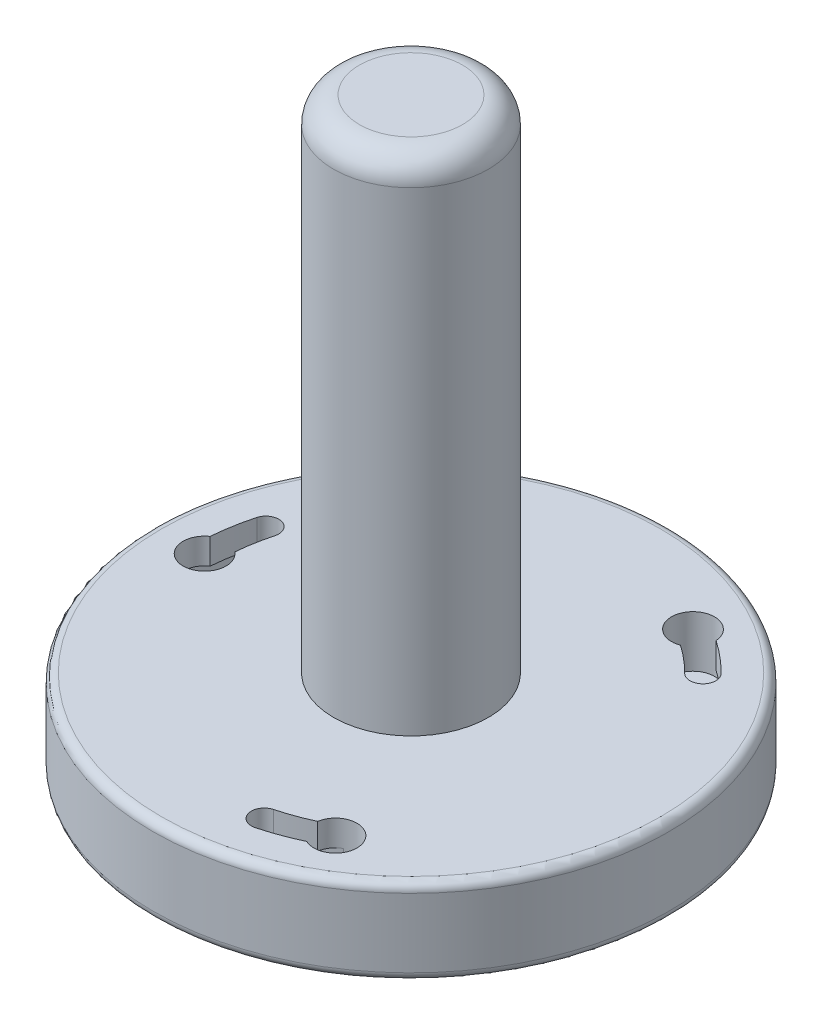
ISO-10303-21;
HEADER;
FILE_DESCRIPTION(('STEP AP214'),'2;1');
FILE_NAME('part.step','',(''),(''),'','','');
FILE_SCHEMA(('AUTOMOTIVE_DESIGN { 1 0 10303 214 1 1 1 1 }'));
ENDSEC;
DATA;
#1=APPLICATION_CONTEXT('core data for automotive mechanical design processes');
#2=APPLICATION_PROTOCOL_DEFINITION('international standard','automotive_design',2000,#1);
#3=PRODUCT_CONTEXT('',#1,'mechanical');
#4=PRODUCT('Part','Part','',(#3));
#5=PRODUCT_RELATED_PRODUCT_CATEGORY('part','',(#4));
#6=PRODUCT_DEFINITION_FORMATION('','',#4);
#7=PRODUCT_DEFINITION_CONTEXT('part definition',#1,'design');
#8=PRODUCT_DEFINITION('design','',#6,#7);
#9=PRODUCT_DEFINITION_SHAPE('','',#8);
#10=(LENGTH_UNIT() NAMED_UNIT(*) SI_UNIT(.MILLI.,.METRE.));
#11=(NAMED_UNIT(*) PLANE_ANGLE_UNIT() SI_UNIT($,.RADIAN.));
#12=(NAMED_UNIT(*) SI_UNIT($,.STERADIAN.) SOLID_ANGLE_UNIT());
#13=UNCERTAINTY_MEASURE_WITH_UNIT(LENGTH_MEASURE(1.E-05),#10,'distance_accuracy_value','');
#14=(GEOMETRIC_REPRESENTATION_CONTEXT(3) GLOBAL_UNCERTAINTY_ASSIGNED_CONTEXT((#13)) GLOBAL_UNIT_ASSIGNED_CONTEXT((#10,
#11,#12)) REPRESENTATION_CONTEXT('',''));
#15=CARTESIAN_POINT('',(0.,0.,0.));
#16=DIRECTION('',(0.,0.,1.));
#17=DIRECTION('',(1.,0.,0.));
#18=AXIS2_PLACEMENT_3D('',#15,#16,#17);
#19=CARTESIAN_POINT('',(0.,12.7,0.));
#20=DIRECTION('',(0.,-1.,0.));
#21=DIRECTION('',(0.,0.,-1.));
#22=AXIS2_PLACEMENT_3D('',#19,#20,#21);
#23=CYLINDRICAL_SURFACE('',#22,38.1);
#24=CARTESIAN_POINT('',(0.,1.27,0.));
#25=DIRECTION('',(0.,1.,0.));
#26=DIRECTION('',(0.,0.,1.));
#27=AXIS2_PLACEMENT_3D('',#24,#25,#26);
#28=CIRCLE('',#27,38.1);
#29=CARTESIAN_POINT('',(0.,1.27,38.1));
#30=VERTEX_POINT('',#29);
#31=EDGE_CURVE('E405',#30,#30,#28,.T.);
#32=ORIENTED_EDGE('',*,*,#31,.T.);
#33=EDGE_LOOP('',(#32));
#34=FACE_BOUND('',#33,.T.);
#35=CARTESIAN_POINT('',(0.,11.43,0.));
#36=DIRECTION('',(0.,1.,0.));
#37=DIRECTION('',(0.,0.,1.));
#38=AXIS2_PLACEMENT_3D('',#35,#36,#37);
#39=CIRCLE('',#38,38.1);
#40=CARTESIAN_POINT('',(0.,11.43,38.1));
#41=VERTEX_POINT('',#40);
#42=EDGE_CURVE('E402',#41,#41,#39,.F.);
#43=ORIENTED_EDGE('',*,*,#42,.T.);
#44=EDGE_LOOP('',(#43));
#45=FACE_BOUND('',#44,.T.);
#46=ADVANCED_FACE('F34',(#34,#45),#23,.T.);
#47=CARTESIAN_POINT('',(0.,12.7,0.));
#48=DIRECTION('',(0.,1.,0.));
#49=DIRECTION('',(0.,0.,1.));
#50=AXIS2_PLACEMENT_3D('',#47,#48,#49);
#51=PLANE('',#50);
#52=CARTESIAN_POINT('',(0.,12.7,0.));
#53=DIRECTION('',(0.,-1.,0.));
#54=DIRECTION('',(0.,0.,-1.));
#55=AXIS2_PLACEMENT_3D('',#52,#53,#54);
#56=CIRCLE('',#55,32.385);
#57=CARTESIAN_POINT('',(13.8740330184725,12.7,29.2625944304728));
#58=VERTEX_POINT('',#57);
#59=CARTESIAN_POINT('',(8.28653723864922,12.7,31.3068926211542));
#60=VERTEX_POINT('',#59);
#61=EDGE_CURVE('E303',#58,#60,#56,.T.);
#62=ORIENTED_EDGE('',*,*,#61,.T.);
#63=CARTESIAN_POINT('',(7.79909387166985,12.7,29.4653107022628));
#64=DIRECTION('',(0.,-1.,0.));
#65=DIRECTION('',(0.,0.,-1.));
#66=AXIS2_PLACEMENT_3D('',#63,#64,#65);
#67=CIRCLE('',#66,1.905);
#68=CARTESIAN_POINT('',(7.31165050469049,12.7,27.6237287833714));
#69=VERTEX_POINT('',#68);
#70=EDGE_CURVE('E49',#60,#69,#67,.T.);
#71=ORIENTED_EDGE('',*,*,#70,.T.);
#72=CARTESIAN_POINT('',(0.,12.7,0.));
#73=DIRECTION('',(0.,1.,0.));
#74=DIRECTION('',(0.,0.,-1.));
#75=AXIS2_PLACEMENT_3D('',#72,#73,#74);
#76=CIRCLE('',#75,28.575);
#77=CARTESIAN_POINT('',(12.106701586345,12.7,25.8835546573339));
#78=VERTEX_POINT('',#77);
#79=EDGE_CURVE('E315',#69,#78,#76,.T.);
#80=ORIENTED_EDGE('',*,*,#79,.T.);
#81=CARTESIAN_POINT('',(15.2400000000001,12.7,26.3964543073496));
#82=DIRECTION('',(0.,-1.,0.));
#83=DIRECTION('',(0.,0.,-1.));
#84=AXIS2_PLACEMENT_3D('',#81,#82,#83);
#85=CIRCLE('',#84,3.175);
#86=EDGE_CURVE('E319',#78,#58,#85,.T.);
#87=ORIENTED_EDGE('',*,*,#86,.T.);
#88=EDGE_LOOP('',(#62,#71,#80,#87));
#89=FACE_BOUND('',#88,.T.);
#90=CARTESIAN_POINT('',(0.,12.7,0.));
#91=DIRECTION('',(0.,-1.,0.));
#92=DIRECTION('',(0.,0.,-1.));
#93=AXIS2_PLACEMENT_3D('',#90,#91,#92);
#94=CIRCLE('',#93,32.385);
#95=CARTESIAN_POINT('',(18.4051336481941,12.7,-26.6465622621777));
#96=VERTEX_POINT('',#95);
#97=CARTESIAN_POINT('',(22.9692957041464,12.7,-22.8297980686532));
#98=VERTEX_POINT('',#97);
#99=EDGE_CURVE('E336',#96,#98,#94,.T.);
#100=ORIENTED_EDGE('',*,*,#99,.T.);
#101=CARTESIAN_POINT('',(21.618160662726,12.7,-21.4868687704971));
#102=DIRECTION('',(0.,-1.,0.));
#103=DIRECTION('',(0.,0.,-1.));
#104=AXIS2_PLACEMENT_3D('',#101,#102,#103);
#105=CIRCLE('',#104,1.905);
#106=CARTESIAN_POINT('',(20.2670256213057,12.7,-20.143939472341));
#107=VERTEX_POINT('',#106);
#108=EDGE_CURVE('E57',#98,#107,#105,.T.);
#109=ORIENTED_EDGE('',*,*,#108,.T.);
#110=CARTESIAN_POINT('',(0.,12.7,0.));
#111=DIRECTION('',(0.,1.,0.));
#112=DIRECTION('',(0.,0.,-1.));
#113=AXIS2_PLACEMENT_3D('',#110,#111,#112);
#114=CIRCLE('',#113,28.575);
#115=CARTESIAN_POINT('',(16.3624650803216,12.7,-23.4264884584791));
#116=VERTEX_POINT('',#115);
#117=EDGE_CURVE('E348',#107,#116,#114,.T.);
#118=ORIENTED_EDGE('',*,*,#117,.T.);
#119=CARTESIAN_POINT('',(15.2399999999998,12.7,-26.3964543073498));
#120=DIRECTION('',(0.,-1.,0.));
#121=DIRECTION('',(0.,0.,-1.));
#122=AXIS2_PLACEMENT_3D('',#119,#120,#121);
#123=CIRCLE('',#122,3.175);
#124=EDGE_CURVE('E351',#116,#96,#123,.T.);
#125=ORIENTED_EDGE('',*,*,#124,.T.);
#126=EDGE_LOOP('',(#100,#109,#118,#125));
#127=FACE_BOUND('',#126,.T.);
#128=CARTESIAN_POINT('',(-30.48,12.7,0.));
#129=DIRECTION('',(0.,-1.,0.));
#130=DIRECTION('',(0.,0.,-1.));
#131=AXIS2_PLACEMENT_3D('',#128,#129,#130);
#132=CIRCLE('',#131,3.175);
#133=CARTESIAN_POINT('',(-28.4691666666667,12.7,-2.45706619885497));
#134=VERTEX_POINT('',#133);
#135=CARTESIAN_POINT('',(-32.2791666666667,12.7,-2.61603216829525));
#136=VERTEX_POINT('',#135);
#137=EDGE_CURVE('E366',#134,#136,#132,.T.);
#138=ORIENTED_EDGE('',*,*,#137,.T.);
#139=CARTESIAN_POINT('',(0.,12.7,0.));
#140=DIRECTION('',(0.,-1.,0.));
#141=DIRECTION('',(0.,0.,-1.));
#142=AXIS2_PLACEMENT_3D('',#139,#140,#141);
#143=CIRCLE('',#142,32.385);
#144=CARTESIAN_POINT('',(-31.2558329427957,12.7,-8.47709455250127));
#145=VERTEX_POINT('',#144);
#146=EDGE_CURVE('E331',#136,#145,#143,.T.);
#147=ORIENTED_EDGE('',*,*,#146,.T.);
#148=CARTESIAN_POINT('',(-29.417254534396,12.7,-7.97844193176591));
#149=DIRECTION('',(0.,-1.,0.));
#150=DIRECTION('',(0.,0.,-1.));
#151=AXIS2_PLACEMENT_3D('',#148,#149,#150);
#152=CIRCLE('',#151,1.905);
#153=CARTESIAN_POINT('',(-27.5786761259962,12.7,-7.47978931103054));
#154=VERTEX_POINT('',#153);
#155=EDGE_CURVE('E379',#145,#154,#152,.T.);
#156=ORIENTED_EDGE('',*,*,#155,.T.);
#157=CARTESIAN_POINT('',(0.,12.7,0.));
#158=DIRECTION('',(0.,1.,0.));
#159=DIRECTION('',(0.,0.,-1.));
#160=AXIS2_PLACEMENT_3D('',#157,#158,#159);
#161=CIRCLE('',#160,28.575);
#162=EDGE_CURVE('E382',#154,#134,#161,.T.);
#163=ORIENTED_EDGE('',*,*,#162,.T.);
#164=EDGE_LOOP('',(#138,#147,#156,#163));
#165=FACE_BOUND('',#164,.T.);
#166=CARTESIAN_POINT('',(0.,12.7,0.));
#167=DIRECTION('',(0.,1.,0.));
#168=DIRECTION('',(0.,0.,1.));
#169=AXIS2_PLACEMENT_3D('',#166,#167,#168);
#170=CIRCLE('',#169,36.83);
#171=CARTESIAN_POINT('',(0.,12.7,36.83));
#172=VERTEX_POINT('',#171);
#173=EDGE_CURVE('E399',#172,#172,#170,.T.);
#174=ORIENTED_EDGE('',*,*,#173,.T.);
#175=EDGE_LOOP('',(#174));
#176=FACE_BOUND('',#175,.T.);
#177=CARTESIAN_POINT('',(0.,12.7,0.));
#178=DIRECTION('',(0.,1.,0.));
#179=DIRECTION('',(0.,0.,1.));
#180=AXIS2_PLACEMENT_3D('',#177,#178,#179);
#181=CIRCLE('',#180,11.43);
#182=CARTESIAN_POINT('',(0.,12.7,11.43));
#183=VERTEX_POINT('',#182);
#184=EDGE_CURVE('E396',#183,#183,#181,.T.);
#185=ORIENTED_EDGE('',*,*,#184,.F.);
#186=EDGE_LOOP('',(#185));
#187=FACE_BOUND('',#186,.T.);
#188=ADVANCED_FACE('F430',(#89,#127,#165,#176,#187),#51,.T.);
#189=CARTESIAN_POINT('',(0.,0.,0.));
#190=DIRECTION('',(0.,1.,0.));
#191=DIRECTION('',(0.,0.,1.));
#192=AXIS2_PLACEMENT_3D('',#189,#190,#191);
#193=PLANE('',#192);
#194=CARTESIAN_POINT('',(0.,0.,0.));
#195=DIRECTION('',(0.,1.,0.));
#196=DIRECTION('',(0.,0.,1.));
#197=AXIS2_PLACEMENT_3D('',#194,#195,#196);
#198=CIRCLE('',#197,36.83);
#199=CARTESIAN_POINT('',(0.,0.,36.83));
#200=VERTEX_POINT('',#199);
#201=EDGE_CURVE('E408',#200,#200,#198,.F.);
#202=ORIENTED_EDGE('',*,*,#201,.T.);
#203=EDGE_LOOP('',(#202));
#204=FACE_BOUND('',#203,.T.);
#205=ADVANCED_FACE('F436',(#204),#193,.F.);
#206=CARTESIAN_POINT('',(0.,86.614,0.));
#207=DIRECTION('',(0.,-1.,0.));
#208=DIRECTION('',(0.,0.,-1.));
#209=AXIS2_PLACEMENT_3D('',#206,#207,#208);
#210=CYLINDRICAL_SURFACE('',#209,11.43);
#211=CARTESIAN_POINT('',(0.,82.804,0.));
#212=DIRECTION('',(0.,1.,0.));
#213=DIRECTION('',(0.,0.,1.));
#214=AXIS2_PLACEMENT_3D('',#211,#212,#213);
#215=CIRCLE('',#214,11.43);
#216=CARTESIAN_POINT('',(0.,82.804,11.43));
#217=VERTEX_POINT('',#216);
#218=EDGE_CURVE('E11',#217,#217,#215,.F.);
#219=ORIENTED_EDGE('',*,*,#218,.T.);
#220=EDGE_LOOP('',(#219));
#221=FACE_BOUND('',#220,.T.);
#222=ORIENTED_EDGE('',*,*,#184,.T.);
#223=EDGE_LOOP('',(#222));
#224=FACE_BOUND('',#223,.T.);
#225=ADVANCED_FACE('F447',(#221,#224),#210,.T.);
#226=CARTESIAN_POINT('',(0.,86.614,0.));
#227=DIRECTION('',(0.,1.,0.));
#228=DIRECTION('',(0.,0.,1.));
#229=AXIS2_PLACEMENT_3D('',#226,#227,#228);
#230=PLANE('',#229);
#231=CARTESIAN_POINT('',(0.,86.614,0.));
#232=DIRECTION('',(0.,1.,0.));
#233=DIRECTION('',(0.,0.,1.));
#234=AXIS2_PLACEMENT_3D('',#231,#232,#233);
#235=CIRCLE('',#234,7.62);
#236=CARTESIAN_POINT('',(0.,86.614,7.62));
#237=VERTEX_POINT('',#236);
#238=EDGE_CURVE('E42',#237,#237,#235,.T.);
#239=ORIENTED_EDGE('',*,*,#238,.T.);
#240=EDGE_LOOP('',(#239));
#241=FACE_BOUND('',#240,.T.);
#242=ADVANCED_FACE('F413',(#241),#230,.T.);
#243=CARTESIAN_POINT('',(0.,11.43,0.));
#244=DIRECTION('',(0.,1.,0.));
#245=DIRECTION('',(0.,0.,1.));
#246=AXIS2_PLACEMENT_3D('',#243,#244,#245);
#247=TOROIDAL_SURFACE('',#246,36.83,1.27);
#248=ORIENTED_EDGE('',*,*,#42,.F.);
#249=EDGE_LOOP('',(#248));
#250=FACE_BOUND('',#249,.T.);
#251=ORIENTED_EDGE('',*,*,#173,.F.);
#252=EDGE_LOOP('',(#251));
#253=FACE_BOUND('',#252,.T.);
#254=ADVANCED_FACE('F426',(#250,#253),#247,.T.);
#255=CARTESIAN_POINT('',(0.,1.27,0.));
#256=DIRECTION('',(0.,1.,0.));
#257=DIRECTION('',(0.,0.,1.));
#258=AXIS2_PLACEMENT_3D('',#255,#256,#257);
#259=TOROIDAL_SURFACE('',#258,36.83,1.27);
#260=ORIENTED_EDGE('',*,*,#201,.F.);
#261=EDGE_LOOP('',(#260));
#262=FACE_BOUND('',#261,.T.);
#263=ORIENTED_EDGE('',*,*,#31,.F.);
#264=EDGE_LOOP('',(#263));
#265=FACE_BOUND('',#264,.T.);
#266=ADVANCED_FACE('F417',(#262,#265),#259,.T.);
#267=CARTESIAN_POINT('',(0.,82.804,0.));
#268=DIRECTION('',(0.,1.,0.));
#269=DIRECTION('',(0.,0.,1.));
#270=AXIS2_PLACEMENT_3D('',#267,#268,#269);
#271=TOROIDAL_SURFACE('',#270,7.62,3.81);
#272=ORIENTED_EDGE('',*,*,#218,.F.);
#273=EDGE_LOOP('',(#272));
#274=FACE_BOUND('',#273,.T.);
#275=ORIENTED_EDGE('',*,*,#238,.F.);
#276=EDGE_LOOP('',(#275));
#277=FACE_BOUND('',#276,.T.);
#278=ADVANCED_FACE('F36',(#274,#277),#271,.T.);
#279=CARTESIAN_POINT('',(0.,8.89,0.));
#280=DIRECTION('',(0.,1.,0.));
#281=DIRECTION('',(0.,0.,1.));
#282=AXIS2_PLACEMENT_3D('',#279,#280,#281);
#283=CYLINDRICAL_SURFACE('',#282,32.385);
#284=ORIENTED_EDGE('',*,*,#146,.F.);
#285=DIRECTION('',(0.,1.,0.));
#286=VECTOR('',#285,1.);
#287=CARTESIAN_POINT('',(-32.2791666666667,8.89,-2.61603216829525));
#288=LINE('',#287,#286);
#289=CARTESIAN_POINT('',(-32.2791666666667,8.89,-2.61603216829525));
#290=VERTEX_POINT('',#289);
#291=EDGE_CURVE('E376',#290,#136,#288,.T.);
#292=ORIENTED_EDGE('',*,*,#291,.F.);
#293=CARTESIAN_POINT('',(0.,8.89,0.));
#294=DIRECTION('',(0.,-1.,0.));
#295=DIRECTION('',(0.,0.,-1.));
#296=AXIS2_PLACEMENT_3D('',#293,#294,#295);
#297=CIRCLE('',#296,32.385);
#298=CARTESIAN_POINT('',(-31.2558329427957,8.89,-8.47709455250127));
#299=VERTEX_POINT('',#298);
#300=EDGE_CURVE('E362',#290,#299,#297,.T.);
#301=ORIENTED_EDGE('',*,*,#300,.T.);
#302=DIRECTION('',(0.,1.,0.));
#303=VECTOR('',#302,1.);
#304=CARTESIAN_POINT('',(-31.2558329427957,8.89,-8.47709455250127));
#305=LINE('',#304,#303);
#306=EDGE_CURVE('E393',#299,#145,#305,.T.);
#307=ORIENTED_EDGE('',*,*,#306,.T.);
#308=EDGE_LOOP('',(#284,#292,#301,#307));
#309=FACE_BOUND('',#308,.T.);
#310=ADVANCED_FACE('F416',(#309),#283,.F.);
#311=CARTESIAN_POINT('',(-29.417254534396,8.89,-7.97844193176591));
#312=DIRECTION('',(0.,1.,0.));
#313=DIRECTION('',(0.,0.,1.));
#314=AXIS2_PLACEMENT_3D('',#311,#312,#313);
#315=CYLINDRICAL_SURFACE('',#314,1.905);
#316=ORIENTED_EDGE('',*,*,#155,.F.);
#317=ORIENTED_EDGE('',*,*,#306,.F.);
#318=CARTESIAN_POINT('',(-29.417254534396,8.89,-7.97844193176591));
#319=DIRECTION('',(0.,-1.,0.));
#320=DIRECTION('',(0.,0.,-1.));
#321=AXIS2_PLACEMENT_3D('',#318,#319,#320);
#322=CIRCLE('',#321,1.905);
#323=CARTESIAN_POINT('',(-27.5786761259962,8.89,-7.47978931103054));
#324=VERTEX_POINT('',#323);
#325=EDGE_CURVE('E365',#299,#324,#322,.T.);
#326=ORIENTED_EDGE('',*,*,#325,.T.);
#327=DIRECTION('',(0.,1.,0.));
#328=VECTOR('',#327,1.);
#329=CARTESIAN_POINT('',(-27.5786761259962,8.89,-7.47978931103054));
#330=LINE('',#329,#328);
#331=EDGE_CURVE('E391',#324,#154,#330,.T.);
#332=ORIENTED_EDGE('',*,*,#331,.T.);
#333=EDGE_LOOP('',(#316,#317,#326,#332));
#334=FACE_BOUND('',#333,.T.);
#335=ADVANCED_FACE('F423',(#334),#315,.F.);
#336=CARTESIAN_POINT('',(0.,8.89,0.));
#337=DIRECTION('',(0.,1.,0.));
#338=DIRECTION('',(0.,0.,1.));
#339=AXIS2_PLACEMENT_3D('',#336,#337,#338);
#340=CYLINDRICAL_SURFACE('',#339,28.575);
#341=ORIENTED_EDGE('',*,*,#162,.F.);
#342=ORIENTED_EDGE('',*,*,#331,.F.);
#343=CARTESIAN_POINT('',(0.,8.89,0.));
#344=DIRECTION('',(0.,1.,0.));
#345=DIRECTION('',(0.,0.,-1.));
#346=AXIS2_PLACEMENT_3D('',#343,#344,#345);
#347=CIRCLE('',#346,28.575);
#348=CARTESIAN_POINT('',(-28.4691666666667,8.89,-2.45706619885497));
#349=VERTEX_POINT('',#348);
#350=EDGE_CURVE('E369',#324,#349,#347,.T.);
#351=ORIENTED_EDGE('',*,*,#350,.T.);
#352=DIRECTION('',(0.,1.,0.));
#353=VECTOR('',#352,1.);
#354=CARTESIAN_POINT('',(-28.4691666666667,8.89,-2.45706619885497));
#355=LINE('',#354,#353);
#356=EDGE_CURVE('E389',#349,#134,#355,.T.);
#357=ORIENTED_EDGE('',*,*,#356,.T.);
#358=EDGE_LOOP('',(#341,#342,#351,#357));
#359=FACE_BOUND('',#358,.T.);
#360=ADVANCED_FACE('F466',(#359),#340,.T.);
#361=CARTESIAN_POINT('',(-30.48,8.89,0.));
#362=DIRECTION('',(0.,1.,0.));
#363=DIRECTION('',(0.,0.,1.));
#364=AXIS2_PLACEMENT_3D('',#361,#362,#363);
#365=CYLINDRICAL_SURFACE('',#364,3.175);
#366=ORIENTED_EDGE('',*,*,#137,.F.);
#367=ORIENTED_EDGE('',*,*,#356,.F.);
#368=CARTESIAN_POINT('',(-30.48,8.89,0.));
#369=DIRECTION('',(0.,-1.,0.));
#370=DIRECTION('',(0.,0.,-1.));
#371=AXIS2_PLACEMENT_3D('',#368,#369,#370);
#372=CIRCLE('',#371,3.175);
#373=CARTESIAN_POINT('',(-27.305,8.89,0.));
#374=VERTEX_POINT('',#373);
#375=EDGE_CURVE('E373',#349,#374,#372,.T.);
#376=ORIENTED_EDGE('',*,*,#375,.T.);
#377=DIRECTION('',(0.,1.,0.));
#378=VECTOR('',#377,1.);
#379=CARTESIAN_POINT('',(-27.305,5.08,0.));
#380=LINE('',#379,#378);
#381=CARTESIAN_POINT('',(-27.305,5.08,0.));
#382=VERTEX_POINT('',#381);
#383=EDGE_CURVE('E238',#382,#374,#380,.T.);
#384=ORIENTED_EDGE('',*,*,#383,.F.);
#385=CARTESIAN_POINT('',(-30.48,5.08,0.));
#386=DIRECTION('',(0.,1.,0.));
#387=DIRECTION('',(0.,0.,1.));
#388=AXIS2_PLACEMENT_3D('',#385,#386,#387);
#389=CIRCLE('',#388,3.17500000000001);
#390=CARTESIAN_POINT('',(-33.655,5.08,0.));
#391=VERTEX_POINT('',#390);
#392=EDGE_CURVE('E220',#391,#382,#389,.T.);
#393=ORIENTED_EDGE('',*,*,#392,.F.);
#394=DIRECTION('',(0.,1.,0.));
#395=VECTOR('',#394,1.);
#396=CARTESIAN_POINT('',(-33.655,5.08,0.));
#397=LINE('',#396,#395);
#398=CARTESIAN_POINT('',(-33.655,8.89,0.));
#399=VERTEX_POINT('',#398);
#400=EDGE_CURVE('E210',#391,#399,#397,.T.);
#401=ORIENTED_EDGE('',*,*,#400,.T.);
#402=EDGE_CURVE('E372',#399,#290,#372,.T.);
#403=ORIENTED_EDGE('',*,*,#402,.T.);
#404=ORIENTED_EDGE('',*,*,#291,.T.);
#405=EDGE_LOOP('',(#366,#367,#376,#384,#393,#401,#403,#404));
#406=FACE_BOUND('',#405,.T.);
#407=ADVANCED_FACE('F470',(#406),#365,.F.);
#408=CARTESIAN_POINT('',(21.618160662726,8.89,-21.4868687704971));
#409=DIRECTION('',(0.,1.,0.));
#410=DIRECTION('',(0.,0.,1.));
#411=AXIS2_PLACEMENT_3D('',#408,#409,#410);
#412=CYLINDRICAL_SURFACE('',#411,1.905);
#413=ORIENTED_EDGE('',*,*,#108,.F.);
#414=DIRECTION('',(0.,1.,0.));
#415=VECTOR('',#414,1.);
#416=CARTESIAN_POINT('',(22.9692957041464,8.89,-22.8297980686532));
#417=LINE('',#416,#415);
#418=CARTESIAN_POINT('',(22.9692957041464,8.89,-22.8297980686532));
#419=VERTEX_POINT('',#418);
#420=EDGE_CURVE('E346',#419,#98,#417,.T.);
#421=ORIENTED_EDGE('',*,*,#420,.F.);
#422=CARTESIAN_POINT('',(21.618160662726,8.89,-21.4868687704971));
#423=DIRECTION('',(0.,-1.,0.));
#424=DIRECTION('',(0.,0.,-1.));
#425=AXIS2_PLACEMENT_3D('',#422,#423,#424);
#426=CIRCLE('',#425,1.905);
#427=CARTESIAN_POINT('',(20.2670256213057,8.89,-20.143939472341));
#428=VERTEX_POINT('',#427);
#429=EDGE_CURVE('E332',#419,#428,#426,.T.);
#430=ORIENTED_EDGE('',*,*,#429,.T.);
#431=DIRECTION('',(0.,1.,0.));
#432=VECTOR('',#431,1.);
#433=CARTESIAN_POINT('',(20.2670256213057,8.89,-20.143939472341));
#434=LINE('',#433,#432);
#435=EDGE_CURVE('E316',#428,#107,#434,.T.);
#436=ORIENTED_EDGE('',*,*,#435,.T.);
#437=EDGE_LOOP('',(#413,#421,#430,#436));
#438=FACE_BOUND('',#437,.T.);
#439=ADVANCED_FACE('F474',(#438),#412,.F.);
#440=CARTESIAN_POINT('',(0.,8.89,0.));
#441=DIRECTION('',(0.,1.,0.));
#442=DIRECTION('',(0.,0.,1.));
#443=AXIS2_PLACEMENT_3D('',#440,#441,#442);
#444=CYLINDRICAL_SURFACE('',#443,28.575);
#445=ORIENTED_EDGE('',*,*,#117,.F.);
#446=ORIENTED_EDGE('',*,*,#435,.F.);
#447=CARTESIAN_POINT('',(0.,8.89,0.));
#448=DIRECTION('',(0.,1.,0.));
#449=DIRECTION('',(0.,0.,-1.));
#450=AXIS2_PLACEMENT_3D('',#447,#448,#449);
#451=CIRCLE('',#450,28.575);
#452=CARTESIAN_POINT('',(16.3624650803216,8.89,-23.4264884584791));
#453=VERTEX_POINT('',#452);
#454=EDGE_CURVE('E335',#428,#453,#451,.T.);
#455=ORIENTED_EDGE('',*,*,#454,.T.);
#456=DIRECTION('',(0.,1.,0.));
#457=VECTOR('',#456,1.);
#458=CARTESIAN_POINT('',(16.3624650803216,8.89,-23.4264884584791));
#459=LINE('',#458,#457);
#460=EDGE_CURVE('E359',#453,#116,#459,.T.);
#461=ORIENTED_EDGE('',*,*,#460,.T.);
#462=EDGE_LOOP('',(#445,#446,#455,#461));
#463=FACE_BOUND('',#462,.T.);
#464=ADVANCED_FACE('F478',(#463),#444,.T.);
#465=CARTESIAN_POINT('',(15.2399999999998,8.89,-26.3964543073498));
#466=DIRECTION('',(0.,1.,0.));
#467=DIRECTION('',(0.,0.,1.));
#468=AXIS2_PLACEMENT_3D('',#465,#466,#467);
#469=CYLINDRICAL_SURFACE('',#468,3.175);
#470=ORIENTED_EDGE('',*,*,#124,.F.);
#471=ORIENTED_EDGE('',*,*,#460,.F.);
#472=CARTESIAN_POINT('',(15.2399999999998,8.89,-26.3964543073498));
#473=DIRECTION('',(0.,-1.,0.));
#474=DIRECTION('',(0.,0.,-1.));
#475=AXIS2_PLACEMENT_3D('',#472,#473,#474);
#476=CIRCLE('',#475,3.175);
#477=CARTESIAN_POINT('',(13.6525000000001,8.89,-23.646823650334));
#478=VERTEX_POINT('',#477);
#479=EDGE_CURVE('E340',#453,#478,#476,.T.);
#480=ORIENTED_EDGE('',*,*,#479,.T.);
#481=DIRECTION('',(0.,1.,0.));
#482=VECTOR('',#481,1.);
#483=CARTESIAN_POINT('',(13.6525000000001,5.08,-23.646823650334));
#484=LINE('',#483,#482);
#485=CARTESIAN_POINT('',(13.6525000000001,5.08,-23.646823650334));
#486=VERTEX_POINT('',#485);
#487=EDGE_CURVE('E264',#486,#478,#484,.T.);
#488=ORIENTED_EDGE('',*,*,#487,.F.);
#489=CARTESIAN_POINT('',(15.2400000000001,5.08,-26.3964543073496));
#490=DIRECTION('',(0.,1.,0.));
#491=DIRECTION('',(0.,0.,1.));
#492=AXIS2_PLACEMENT_3D('',#489,#490,#491);
#493=CIRCLE('',#492,3.175);
#494=CARTESIAN_POINT('',(16.8275000000001,5.08,-29.1460849643652));
#495=VERTEX_POINT('',#494);
#496=EDGE_CURVE('E248',#495,#486,#493,.T.);
#497=ORIENTED_EDGE('',*,*,#496,.F.);
#498=DIRECTION('',(0.,1.,0.));
#499=VECTOR('',#498,1.);
#500=CARTESIAN_POINT('',(16.8275000000001,5.08,-29.1460849643652));
#501=LINE('',#500,#499);
#502=CARTESIAN_POINT('',(16.8275000000001,8.89,-29.1460849643652));
#503=VERTEX_POINT('',#502);
#504=EDGE_CURVE('E266',#495,#503,#501,.T.);
#505=ORIENTED_EDGE('',*,*,#504,.T.);
#506=CARTESIAN_POINT('',(18.4051336481941,8.89,-26.6465622621777));
#507=VERTEX_POINT('',#506);
#508=EDGE_CURVE('E339',#503,#507,#476,.T.);
#509=ORIENTED_EDGE('',*,*,#508,.T.);
#510=DIRECTION('',(0.,1.,0.));
#511=VECTOR('',#510,1.);
#512=CARTESIAN_POINT('',(18.4051336481941,8.89,-26.6465622621777));
#513=LINE('',#512,#511);
#514=EDGE_CURVE('E357',#507,#96,#513,.T.);
#515=ORIENTED_EDGE('',*,*,#514,.T.);
#516=EDGE_LOOP('',(#470,#471,#480,#488,#497,#505,#509,#515));
#517=FACE_BOUND('',#516,.T.);
#518=ADVANCED_FACE('F481',(#517),#469,.F.);
#519=CARTESIAN_POINT('',(0.,8.89,0.));
#520=DIRECTION('',(0.,1.,0.));
#521=DIRECTION('',(0.,0.,1.));
#522=AXIS2_PLACEMENT_3D('',#519,#520,#521);
#523=CYLINDRICAL_SURFACE('',#522,32.385);
#524=ORIENTED_EDGE('',*,*,#99,.F.);
#525=ORIENTED_EDGE('',*,*,#514,.F.);
#526=CARTESIAN_POINT('',(0.,8.89,0.));
#527=DIRECTION('',(0.,-1.,0.));
#528=DIRECTION('',(0.,0.,-1.));
#529=AXIS2_PLACEMENT_3D('',#526,#527,#528);
#530=CIRCLE('',#529,32.385);
#531=EDGE_CURVE('E343',#507,#419,#530,.T.);
#532=ORIENTED_EDGE('',*,*,#531,.T.);
#533=ORIENTED_EDGE('',*,*,#420,.T.);
#534=EDGE_LOOP('',(#524,#525,#532,#533));
#535=FACE_BOUND('',#534,.T.);
#536=ADVANCED_FACE('F485',(#535),#523,.F.);
#537=CARTESIAN_POINT('',(7.79909387166985,8.89,29.4653107022628));
#538=DIRECTION('',(0.,1.,0.));
#539=DIRECTION('',(0.,0.,1.));
#540=AXIS2_PLACEMENT_3D('',#537,#538,#539);
#541=CYLINDRICAL_SURFACE('',#540,1.905);
#542=ORIENTED_EDGE('',*,*,#70,.F.);
#543=DIRECTION('',(0.,1.,0.));
#544=VECTOR('',#543,1.);
#545=CARTESIAN_POINT('',(8.28653723864922,8.89,31.3068926211542));
#546=LINE('',#545,#544);
#547=CARTESIAN_POINT('',(8.28653723864922,8.89,31.3068926211542));
#548=VERTEX_POINT('',#547);
#549=EDGE_CURVE('E313',#548,#60,#546,.T.);
#550=ORIENTED_EDGE('',*,*,#549,.F.);
#551=CARTESIAN_POINT('',(7.79909387166985,8.89,29.4653107022628));
#552=DIRECTION('',(0.,-1.,0.));
#553=DIRECTION('',(0.,0.,-1.));
#554=AXIS2_PLACEMENT_3D('',#551,#552,#553);
#555=CIRCLE('',#554,1.905);
#556=CARTESIAN_POINT('',(7.31165050469049,8.89,27.6237287833714));
#557=VERTEX_POINT('',#556);
#558=EDGE_CURVE('E299',#548,#557,#555,.T.);
#559=ORIENTED_EDGE('',*,*,#558,.T.);
#560=DIRECTION('',(0.,1.,0.));
#561=VECTOR('',#560,1.);
#562=CARTESIAN_POINT('',(7.31165050469049,8.89,27.6237287833714));
#563=LINE('',#562,#561);
#564=EDGE_CURVE('E329',#557,#69,#563,.T.);
#565=ORIENTED_EDGE('',*,*,#564,.T.);
#566=EDGE_LOOP('',(#542,#550,#559,#565));
#567=FACE_BOUND('',#566,.T.);
#568=ADVANCED_FACE('F489',(#567),#541,.F.);
#569=CARTESIAN_POINT('',(0.,8.89,0.));
#570=DIRECTION('',(0.,1.,0.));
#571=DIRECTION('',(0.,0.,1.));
#572=AXIS2_PLACEMENT_3D('',#569,#570,#571);
#573=CYLINDRICAL_SURFACE('',#572,28.575);
#574=ORIENTED_EDGE('',*,*,#79,.F.);
#575=ORIENTED_EDGE('',*,*,#564,.F.);
#576=CARTESIAN_POINT('',(0.,8.89,0.));
#577=DIRECTION('',(0.,1.,0.));
#578=DIRECTION('',(0.,0.,-1.));
#579=AXIS2_PLACEMENT_3D('',#576,#577,#578);
#580=CIRCLE('',#579,28.575);
#581=CARTESIAN_POINT('',(12.106701586345,8.89,25.8835546573339));
#582=VERTEX_POINT('',#581);
#583=EDGE_CURVE('E302',#557,#582,#580,.T.);
#584=ORIENTED_EDGE('',*,*,#583,.T.);
#585=DIRECTION('',(0.,1.,0.));
#586=VECTOR('',#585,1.);
#587=CARTESIAN_POINT('',(12.106701586345,8.89,25.8835546573339));
#588=LINE('',#587,#586);
#589=EDGE_CURVE('E327',#582,#78,#588,.T.);
#590=ORIENTED_EDGE('',*,*,#589,.T.);
#591=EDGE_LOOP('',(#574,#575,#584,#590));
#592=FACE_BOUND('',#591,.T.);
#593=ADVANCED_FACE('F493',(#592),#573,.T.);
#594=CARTESIAN_POINT('',(15.2400000000001,8.89,26.3964543073496));
#595=DIRECTION('',(0.,1.,0.));
#596=DIRECTION('',(0.,0.,1.));
#597=AXIS2_PLACEMENT_3D('',#594,#595,#596);
#598=CYLINDRICAL_SURFACE('',#597,3.175);
#599=ORIENTED_EDGE('',*,*,#86,.F.);
#600=ORIENTED_EDGE('',*,*,#589,.F.);
#601=CARTESIAN_POINT('',(15.2400000000001,8.89,26.3964543073496));
#602=DIRECTION('',(0.,-1.,0.));
#603=DIRECTION('',(0.,0.,-1.));
#604=AXIS2_PLACEMENT_3D('',#601,#602,#603);
#605=CIRCLE('',#604,3.175);
#606=CARTESIAN_POINT('',(13.6525000000001,8.89,23.646823650334));
#607=VERTEX_POINT('',#606);
#608=EDGE_CURVE('E307',#582,#607,#605,.T.);
#609=ORIENTED_EDGE('',*,*,#608,.T.);
#610=DIRECTION('',(0.,1.,0.));
#611=VECTOR('',#610,1.);
#612=CARTESIAN_POINT('',(13.6525000000001,5.08,23.646823650334));
#613=LINE('',#612,#611);
#614=CARTESIAN_POINT('',(13.6525000000001,5.08,23.646823650334));
#615=VERTEX_POINT('',#614);
#616=EDGE_CURVE('E295',#615,#607,#613,.T.);
#617=ORIENTED_EDGE('',*,*,#616,.F.);
#618=CARTESIAN_POINT('',(15.2400000000001,5.08,26.3964543073496));
#619=DIRECTION('',(0.,1.,0.));
#620=DIRECTION('',(0.,0.,1.));
#621=AXIS2_PLACEMENT_3D('',#618,#619,#620);
#622=CIRCLE('',#621,3.17500000000001);
#623=CARTESIAN_POINT('',(16.8275000000001,5.08,29.1460849643652));
#624=VERTEX_POINT('',#623);
#625=EDGE_CURVE('E273',#624,#615,#622,.T.);
#626=ORIENTED_EDGE('',*,*,#625,.F.);
#627=DIRECTION('',(0.,1.,0.));
#628=VECTOR('',#627,1.);
#629=CARTESIAN_POINT('',(16.8275000000001,5.08,29.1460849643652));
#630=LINE('',#629,#628);
#631=CARTESIAN_POINT('',(16.8275000000001,8.89,29.1460849643652));
#632=VERTEX_POINT('',#631);
#633=EDGE_CURVE('E283',#624,#632,#630,.T.);
#634=ORIENTED_EDGE('',*,*,#633,.T.);
#635=CARTESIAN_POINT('',(13.8740330184725,8.89,29.2625944304728));
#636=VERTEX_POINT('',#635);
#637=EDGE_CURVE('E306',#632,#636,#605,.T.);
#638=ORIENTED_EDGE('',*,*,#637,.T.);
#639=DIRECTION('',(0.,1.,0.));
#640=VECTOR('',#639,1.);
#641=CARTESIAN_POINT('',(13.8740330184725,8.89,29.2625944304728));
#642=LINE('',#641,#640);
#643=EDGE_CURVE('E325',#636,#58,#642,.T.);
#644=ORIENTED_EDGE('',*,*,#643,.T.);
#645=EDGE_LOOP('',(#599,#600,#609,#617,#626,#634,#638,#644));
#646=FACE_BOUND('',#645,.T.);
#647=ADVANCED_FACE('F496',(#646),#598,.F.);
#648=CARTESIAN_POINT('',(0.,8.89,0.));
#649=DIRECTION('',(0.,1.,0.));
#650=DIRECTION('',(0.,0.,1.));
#651=AXIS2_PLACEMENT_3D('',#648,#649,#650);
#652=CYLINDRICAL_SURFACE('',#651,32.385);
#653=ORIENTED_EDGE('',*,*,#61,.F.);
#654=ORIENTED_EDGE('',*,*,#643,.F.);
#655=CARTESIAN_POINT('',(0.,8.89,0.));
#656=DIRECTION('',(0.,-1.,0.));
#657=DIRECTION('',(0.,0.,-1.));
#658=AXIS2_PLACEMENT_3D('',#655,#656,#657);
#659=CIRCLE('',#658,32.385);
#660=EDGE_CURVE('E310',#636,#548,#659,.T.);
#661=ORIENTED_EDGE('',*,*,#660,.T.);
#662=ORIENTED_EDGE('',*,*,#549,.T.);
#663=EDGE_LOOP('',(#653,#654,#661,#662));
#664=FACE_BOUND('',#663,.T.);
#665=ADVANCED_FACE('F500',(#664),#652,.F.);
#666=CARTESIAN_POINT('',(7.62000000000006,8.89,13.1982271536748));
#667=DIRECTION('',(0.,1.,0.));
#668=DIRECTION('',(0.,0.,1.));
#669=AXIS2_PLACEMENT_3D('',#666,#667,#668);
#670=PLANE('',#669);
#671=CARTESIAN_POINT('',(0.,8.89,0.));
#672=DIRECTION('',(0.,1.,0.));
#673=DIRECTION('',(0.,0.,1.));
#674=AXIS2_PLACEMENT_3D('',#671,#672,#673);
#675=CIRCLE('',#674,33.655);
#676=CARTESIAN_POINT('',(8.61149948330212,8.89,32.5346139004152));
#677=VERTEX_POINT('',#676);
#678=EDGE_CURVE('E237',#677,#632,#675,.T.);
#679=ORIENTED_EDGE('',*,*,#678,.F.);
#680=CARTESIAN_POINT('',(7.79909387166985,8.89,29.4653107022628));
#681=DIRECTION('',(0.,1.,0.));
#682=DIRECTION('',(0.,0.,1.));
#683=AXIS2_PLACEMENT_3D('',#680,#681,#682);
#684=CIRCLE('',#683,3.175);
#685=CARTESIAN_POINT('',(6.98668826003757,8.89,26.3960075041104));
#686=VERTEX_POINT('',#685);
#687=EDGE_CURVE('E274',#686,#677,#684,.T.);
#688=ORIENTED_EDGE('',*,*,#687,.F.);
#689=CARTESIAN_POINT('',(0.,8.89,0.));
#690=DIRECTION('',(0.,-1.,0.));
#691=DIRECTION('',(0.,0.,1.));
#692=AXIS2_PLACEMENT_3D('',#689,#690,#691);
#693=CIRCLE('',#692,27.305);
#694=EDGE_CURVE('E286',#607,#686,#693,.T.);
#695=ORIENTED_EDGE('',*,*,#694,.F.);
#696=ORIENTED_EDGE('',*,*,#608,.F.);
#697=ORIENTED_EDGE('',*,*,#583,.F.);
#698=ORIENTED_EDGE('',*,*,#558,.F.);
#699=ORIENTED_EDGE('',*,*,#660,.F.);
#700=ORIENTED_EDGE('',*,*,#637,.F.);
#701=EDGE_LOOP('',(#679,#688,#695,#696,#697,#698,#699,#700));
#702=FACE_BOUND('',#701,.T.);
#703=ADVANCED_FACE('F504',(#702),#670,.F.);
#704=CARTESIAN_POINT('',(0.,5.08,0.));
#705=DIRECTION('',(0.,1.,0.));
#706=DIRECTION('',(0.,0.,1.));
#707=AXIS2_PLACEMENT_3D('',#704,#705,#706);
#708=CYLINDRICAL_SURFACE('',#707,33.655);
#709=ORIENTED_EDGE('',*,*,#678,.T.);
#710=ORIENTED_EDGE('',*,*,#633,.F.);
#711=CARTESIAN_POINT('',(0.,5.08,0.));
#712=DIRECTION('',(0.,1.,0.));
#713=DIRECTION('',(0.,0.,1.));
#714=AXIS2_PLACEMENT_3D('',#711,#712,#713);
#715=CIRCLE('',#714,33.655);
#716=CARTESIAN_POINT('',(8.61149948330212,5.08,32.5346139004152));
#717=VERTEX_POINT('',#716);
#718=EDGE_CURVE('E270',#717,#624,#715,.T.);
#719=ORIENTED_EDGE('',*,*,#718,.F.);
#720=DIRECTION('',(0.,1.,0.));
#721=VECTOR('',#720,1.);
#722=CARTESIAN_POINT('',(8.61149948330212,5.08,32.5346139004152));
#723=LINE('',#722,#721);
#724=EDGE_CURVE('E291',#717,#677,#723,.T.);
#725=ORIENTED_EDGE('',*,*,#724,.T.);
#726=EDGE_LOOP('',(#709,#710,#719,#725));
#727=FACE_BOUND('',#726,.T.);
#728=ADVANCED_FACE('F506',(#727),#708,.F.);
#729=CARTESIAN_POINT('',(7.79909387166985,5.08,29.4653107022628));
#730=DIRECTION('',(0.,1.,0.));
#731=DIRECTION('',(0.,0.,1.));
#732=AXIS2_PLACEMENT_3D('',#729,#730,#731);
#733=CYLINDRICAL_SURFACE('',#732,3.175);
#734=ORIENTED_EDGE('',*,*,#687,.T.);
#735=ORIENTED_EDGE('',*,*,#724,.F.);
#736=CARTESIAN_POINT('',(7.79909387166985,5.08,29.4653107022628));
#737=DIRECTION('',(0.,1.,0.));
#738=DIRECTION('',(0.,0.,1.));
#739=AXIS2_PLACEMENT_3D('',#736,#737,#738);
#740=CIRCLE('',#739,3.175);
#741=CARTESIAN_POINT('',(6.98668826003757,5.08,26.3960075041104));
#742=VERTEX_POINT('',#741);
#743=EDGE_CURVE('E280',#742,#717,#740,.T.);
#744=ORIENTED_EDGE('',*,*,#743,.F.);
#745=DIRECTION('',(0.,1.,0.));
#746=VECTOR('',#745,1.);
#747=CARTESIAN_POINT('',(6.98668826003757,5.08,26.3960075041104));
#748=LINE('',#747,#746);
#749=EDGE_CURVE('E293',#742,#686,#748,.T.);
#750=ORIENTED_EDGE('',*,*,#749,.T.);
#751=EDGE_LOOP('',(#734,#735,#744,#750));
#752=FACE_BOUND('',#751,.T.);
#753=ADVANCED_FACE('F509',(#752),#733,.F.);
#754=CARTESIAN_POINT('',(0.,5.08,0.));
#755=DIRECTION('',(0.,1.,0.));
#756=DIRECTION('',(0.,0.,1.));
#757=AXIS2_PLACEMENT_3D('',#754,#755,#756);
#758=CYLINDRICAL_SURFACE('',#757,27.305);
#759=ORIENTED_EDGE('',*,*,#694,.T.);
#760=ORIENTED_EDGE('',*,*,#749,.F.);
#761=CARTESIAN_POINT('',(0.,5.08,0.));
#762=DIRECTION('',(0.,-1.,0.));
#763=DIRECTION('',(0.,0.,1.));
#764=AXIS2_PLACEMENT_3D('',#761,#762,#763);
#765=CIRCLE('',#764,27.305);
#766=EDGE_CURVE('E277',#615,#742,#765,.T.);
#767=ORIENTED_EDGE('',*,*,#766,.F.);
#768=ORIENTED_EDGE('',*,*,#616,.T.);
#769=EDGE_LOOP('',(#759,#760,#767,#768));
#770=FACE_BOUND('',#769,.T.);
#771=ADVANCED_FACE('F511',(#770),#758,.T.);
#772=CARTESIAN_POINT('',(7.62000000000006,5.08,13.1982271536748));
#773=DIRECTION('',(0.,1.,0.));
#774=DIRECTION('',(0.,0.,1.));
#775=AXIS2_PLACEMENT_3D('',#772,#773,#774);
#776=PLANE('',#775);
#777=ORIENTED_EDGE('',*,*,#718,.T.);
#778=ORIENTED_EDGE('',*,*,#625,.T.);
#779=ORIENTED_EDGE('',*,*,#766,.T.);
#780=ORIENTED_EDGE('',*,*,#743,.T.);
#781=EDGE_LOOP('',(#777,#778,#779,#780));
#782=FACE_BOUND('',#781,.T.);
#783=ADVANCED_FACE('F514',(#782),#776,.T.);
#784=CARTESIAN_POINT('',(10.8090803313632,8.89,-10.7434343852484));
#785=DIRECTION('',(0.,1.,0.));
#786=DIRECTION('',(0.,0.,1.));
#787=AXIS2_PLACEMENT_3D('',#784,#785,#786);
#788=PLANE('',#787);
#789=CARTESIAN_POINT('',(0.,8.89,0.));
#790=DIRECTION('',(0.,1.,0.));
#791=DIRECTION('',(0.,0.,1.));
#792=AXIS2_PLACEMENT_3D('',#789,#790,#791);
#793=CIRCLE('',#792,33.655);
#794=CARTESIAN_POINT('',(23.870052398427,8.89,-23.7250842674236));
#795=VERTEX_POINT('',#794);
#796=EDGE_CURVE('E258',#795,#503,#793,.T.);
#797=ORIENTED_EDGE('',*,*,#796,.F.);
#798=CARTESIAN_POINT('',(21.6181606627264,8.89,-21.4868687704968));
#799=DIRECTION('',(0.,1.,0.));
#800=DIRECTION('',(0.,0.,1.));
#801=AXIS2_PLACEMENT_3D('',#798,#799,#800);
#802=CIRCLE('',#801,3.175);
#803=CARTESIAN_POINT('',(19.3662689270257,8.89,-19.2486532735701));
#804=VERTEX_POINT('',#803);
#805=EDGE_CURVE('E255',#804,#795,#802,.T.);
#806=ORIENTED_EDGE('',*,*,#805,.F.);
#807=CARTESIAN_POINT('',(0.,8.89,0.));
#808=DIRECTION('',(0.,-1.,0.));
#809=DIRECTION('',(0.,0.,1.));
#810=AXIS2_PLACEMENT_3D('',#807,#808,#809);
#811=CIRCLE('',#810,27.305);
#812=EDGE_CURVE('E245',#478,#804,#811,.T.);
#813=ORIENTED_EDGE('',*,*,#812,.F.);
#814=ORIENTED_EDGE('',*,*,#479,.F.);
#815=ORIENTED_EDGE('',*,*,#454,.F.);
#816=ORIENTED_EDGE('',*,*,#429,.F.);
#817=ORIENTED_EDGE('',*,*,#531,.F.);
#818=ORIENTED_EDGE('',*,*,#508,.F.);
#819=EDGE_LOOP('',(#797,#806,#813,#814,#815,#816,#817,#818));
#820=FACE_BOUND('',#819,.T.);
#821=ADVANCED_FACE('F524',(#820),#788,.F.);
#822=CARTESIAN_POINT('',(21.6181606627264,5.08,-21.4868687704968));
#823=DIRECTION('',(0.,1.,0.));
#824=DIRECTION('',(0.,0.,1.));
#825=AXIS2_PLACEMENT_3D('',#822,#823,#824);
#826=CYLINDRICAL_SURFACE('',#825,3.175);
#827=ORIENTED_EDGE('',*,*,#805,.T.);
#828=DIRECTION('',(0.,1.,0.));
#829=VECTOR('',#828,1.);
#830=CARTESIAN_POINT('',(23.870052398427,5.08,-23.7250842674236));
#831=LINE('',#830,#829);
#832=CARTESIAN_POINT('',(23.870052398427,5.08,-23.7250842674236));
#833=VERTEX_POINT('',#832);
#834=EDGE_CURVE('E254',#833,#795,#831,.T.);
#835=ORIENTED_EDGE('',*,*,#834,.F.);
#836=CARTESIAN_POINT('',(21.6181606627264,5.08,-21.4868687704968));
#837=DIRECTION('',(0.,1.,0.));
#838=DIRECTION('',(0.,0.,1.));
#839=AXIS2_PLACEMENT_3D('',#836,#837,#838);
#840=CIRCLE('',#839,3.175);
#841=CARTESIAN_POINT('',(19.3662689270257,5.08,-19.2486532735701));
#842=VERTEX_POINT('',#841);
#843=EDGE_CURVE('E241',#842,#833,#840,.T.);
#844=ORIENTED_EDGE('',*,*,#843,.F.);
#845=DIRECTION('',(0.,1.,0.));
#846=VECTOR('',#845,1.);
#847=CARTESIAN_POINT('',(19.3662689270257,5.08,-19.2486532735701));
#848=LINE('',#847,#846);
#849=EDGE_CURVE('E233',#842,#804,#848,.T.);
#850=ORIENTED_EDGE('',*,*,#849,.T.);
#851=EDGE_LOOP('',(#827,#835,#844,#850));
#852=FACE_BOUND('',#851,.T.);
#853=ADVANCED_FACE('F526',(#852),#826,.F.);
#854=CARTESIAN_POINT('',(0.,5.08,0.));
#855=DIRECTION('',(0.,1.,0.));
#856=DIRECTION('',(0.,0.,1.));
#857=AXIS2_PLACEMENT_3D('',#854,#855,#856);
#858=CYLINDRICAL_SURFACE('',#857,27.305);
#859=ORIENTED_EDGE('',*,*,#812,.T.);
#860=ORIENTED_EDGE('',*,*,#849,.F.);
#861=CARTESIAN_POINT('',(0.,5.08,0.));
#862=DIRECTION('',(0.,-1.,0.));
#863=DIRECTION('',(0.,0.,1.));
#864=AXIS2_PLACEMENT_3D('',#861,#862,#863);
#865=CIRCLE('',#864,27.305);
#866=EDGE_CURVE('E251',#486,#842,#865,.T.);
#867=ORIENTED_EDGE('',*,*,#866,.F.);
#868=ORIENTED_EDGE('',*,*,#487,.T.);
#869=EDGE_LOOP('',(#859,#860,#867,#868));
#870=FACE_BOUND('',#869,.T.);
#871=ADVANCED_FACE('F529',(#870),#858,.T.);
#872=CARTESIAN_POINT('',(0.,5.08,0.));
#873=DIRECTION('',(0.,1.,0.));
#874=DIRECTION('',(0.,0.,1.));
#875=AXIS2_PLACEMENT_3D('',#872,#873,#874);
#876=CYLINDRICAL_SURFACE('',#875,33.655);
#877=ORIENTED_EDGE('',*,*,#796,.T.);
#878=ORIENTED_EDGE('',*,*,#504,.F.);
#879=CARTESIAN_POINT('',(0.,5.08,0.));
#880=DIRECTION('',(0.,1.,0.));
#881=DIRECTION('',(0.,0.,1.));
#882=AXIS2_PLACEMENT_3D('',#879,#880,#881);
#883=CIRCLE('',#882,33.655);
#884=EDGE_CURVE('E244',#833,#495,#883,.T.);
#885=ORIENTED_EDGE('',*,*,#884,.F.);
#886=ORIENTED_EDGE('',*,*,#834,.T.);
#887=EDGE_LOOP('',(#877,#878,#885,#886));
#888=FACE_BOUND('',#887,.T.);
#889=ADVANCED_FACE('F531',(#888),#876,.F.);
#890=CARTESIAN_POINT('',(10.8090803313632,5.08,-10.7434343852484));
#891=DIRECTION('',(0.,1.,0.));
#892=DIRECTION('',(0.,0.,1.));
#893=AXIS2_PLACEMENT_3D('',#890,#891,#892);
#894=PLANE('',#893);
#895=ORIENTED_EDGE('',*,*,#843,.T.);
#896=ORIENTED_EDGE('',*,*,#884,.T.);
#897=ORIENTED_EDGE('',*,*,#496,.T.);
#898=ORIENTED_EDGE('',*,*,#866,.T.);
#899=EDGE_LOOP('',(#895,#896,#897,#898));
#900=FACE_BOUND('',#899,.T.);
#901=ADVANCED_FACE('F534',(#900),#894,.T.);
#902=CARTESIAN_POINT('',(-14.708627267198,8.89,-3.98922096588295));
#903=DIRECTION('',(0.,1.,0.));
#904=DIRECTION('',(0.,0.,1.));
#905=AXIS2_PLACEMENT_3D('',#902,#903,#904);
#906=PLANE('',#905);
#907=CARTESIAN_POINT('',(0.,8.89,0.));
#908=DIRECTION('',(0.,1.,0.));
#909=DIRECTION('',(0.,0.,1.));
#910=AXIS2_PLACEMENT_3D('',#907,#908,#909);
#911=CIRCLE('',#910,33.655);
#912=CARTESIAN_POINT('',(-32.4815518817289,8.89,-8.80952963299155));
#913=VERTEX_POINT('',#912);
#914=EDGE_CURVE('E227',#913,#399,#911,.T.);
#915=ORIENTED_EDGE('',*,*,#914,.F.);
#916=CARTESIAN_POINT('',(-29.417254534396,8.89,-7.97844193176591));
#917=DIRECTION('',(0.,1.,0.));
#918=DIRECTION('',(0.,0.,1.));
#919=AXIS2_PLACEMENT_3D('',#916,#917,#918);
#920=CIRCLE('',#919,3.175);
#921=CARTESIAN_POINT('',(-26.352957187063,8.89,-7.14735423054031));
#922=VERTEX_POINT('',#921);
#923=EDGE_CURVE('E206',#922,#913,#920,.T.);
#924=ORIENTED_EDGE('',*,*,#923,.F.);
#925=CARTESIAN_POINT('',(0.,8.89,0.));
#926=DIRECTION('',(0.,-1.,0.));
#927=DIRECTION('',(0.,0.,1.));
#928=AXIS2_PLACEMENT_3D('',#925,#926,#927);
#929=CIRCLE('',#928,27.305);
#930=EDGE_CURVE('E224',#374,#922,#929,.T.);
#931=ORIENTED_EDGE('',*,*,#930,.F.);
#932=ORIENTED_EDGE('',*,*,#375,.F.);
#933=ORIENTED_EDGE('',*,*,#350,.F.);
#934=ORIENTED_EDGE('',*,*,#325,.F.);
#935=ORIENTED_EDGE('',*,*,#300,.F.);
#936=ORIENTED_EDGE('',*,*,#402,.F.);
#937=EDGE_LOOP('',(#915,#924,#931,#932,#933,#934,#935,#936));
#938=FACE_BOUND('',#937,.T.);
#939=ADVANCED_FACE('F544',(#938),#906,.F.);
#940=CARTESIAN_POINT('',(-29.417254534396,5.08,-7.97844193176591));
#941=DIRECTION('',(0.,1.,0.));
#942=DIRECTION('',(0.,0.,1.));
#943=AXIS2_PLACEMENT_3D('',#940,#941,#942);
#944=CYLINDRICAL_SURFACE('',#943,3.175);
#945=ORIENTED_EDGE('',*,*,#923,.T.);
#946=DIRECTION('',(0.,1.,0.));
#947=VECTOR('',#946,1.);
#948=CARTESIAN_POINT('',(-32.4815518817289,5.08,-8.80952963299155));
#949=LINE('',#948,#947);
#950=CARTESIAN_POINT('',(-32.4815518817289,5.08,-8.80952963299155));
#951=VERTEX_POINT('',#950);
#952=EDGE_CURVE('E199',#951,#913,#949,.T.);
#953=ORIENTED_EDGE('',*,*,#952,.F.);
#954=CARTESIAN_POINT('',(-29.417254534396,5.08,-7.97844193176591));
#955=DIRECTION('',(0.,1.,0.));
#956=DIRECTION('',(0.,0.,1.));
#957=AXIS2_PLACEMENT_3D('',#954,#955,#956);
#958=CIRCLE('',#957,3.175);
#959=CARTESIAN_POINT('',(-26.352957187063,5.08,-7.14735423054031));
#960=VERTEX_POINT('',#959);
#961=EDGE_CURVE('E203',#960,#951,#958,.T.);
#962=ORIENTED_EDGE('',*,*,#961,.F.);
#963=DIRECTION('',(0.,1.,0.));
#964=VECTOR('',#963,1.);
#965=CARTESIAN_POINT('',(-26.352957187063,5.08,-7.14735423054031));
#966=LINE('',#965,#964);
#967=EDGE_CURVE('E235',#960,#922,#966,.T.);
#968=ORIENTED_EDGE('',*,*,#967,.T.);
#969=EDGE_LOOP('',(#945,#953,#962,#968));
#970=FACE_BOUND('',#969,.T.);
#971=ADVANCED_FACE('F201',(#970),#944,.F.);
#972=CARTESIAN_POINT('',(0.,5.08,0.));
#973=DIRECTION('',(0.,1.,0.));
#974=DIRECTION('',(0.,0.,1.));
#975=AXIS2_PLACEMENT_3D('',#972,#973,#974);
#976=CYLINDRICAL_SURFACE('',#975,27.305);
#977=ORIENTED_EDGE('',*,*,#930,.T.);
#978=ORIENTED_EDGE('',*,*,#967,.F.);
#979=CARTESIAN_POINT('',(0.,5.08,0.));
#980=DIRECTION('',(0.,-1.,0.));
#981=DIRECTION('',(0.,0.,1.));
#982=AXIS2_PLACEMENT_3D('',#979,#980,#981);
#983=CIRCLE('',#982,27.305);
#984=EDGE_CURVE('E211',#382,#960,#983,.T.);
#985=ORIENTED_EDGE('',*,*,#984,.F.);
#986=ORIENTED_EDGE('',*,*,#383,.T.);
#987=EDGE_LOOP('',(#977,#978,#985,#986));
#988=FACE_BOUND('',#987,.T.);
#989=ADVANCED_FACE('F548',(#988),#976,.T.);
#990=CARTESIAN_POINT('',(0.,5.08,0.));
#991=DIRECTION('',(0.,1.,0.));
#992=DIRECTION('',(0.,0.,1.));
#993=AXIS2_PLACEMENT_3D('',#990,#991,#992);
#994=CYLINDRICAL_SURFACE('',#993,33.655);
#995=ORIENTED_EDGE('',*,*,#914,.T.);
#996=ORIENTED_EDGE('',*,*,#400,.F.);
#997=CARTESIAN_POINT('',(0.,5.08,0.));
#998=DIRECTION('',(0.,1.,0.));
#999=DIRECTION('',(0.,0.,1.));
#1000=AXIS2_PLACEMENT_3D('',#997,#998,#999);
#1001=CIRCLE('',#1000,33.655);
#1002=EDGE_CURVE('E214',#951,#391,#1001,.T.);
#1003=ORIENTED_EDGE('',*,*,#1002,.F.);
#1004=ORIENTED_EDGE('',*,*,#952,.T.);
#1005=EDGE_LOOP('',(#995,#996,#1003,#1004));
#1006=FACE_BOUND('',#1005,.T.);
#1007=ADVANCED_FACE('F215',(#1006),#994,.F.);
#1008=CARTESIAN_POINT('',(-14.708627267198,5.08,-3.98922096588295));
#1009=DIRECTION('',(0.,1.,0.));
#1010=DIRECTION('',(0.,0.,1.));
#1011=AXIS2_PLACEMENT_3D('',#1008,#1009,#1010);
#1012=PLANE('',#1011);
#1013=ORIENTED_EDGE('',*,*,#961,.T.);
#1014=ORIENTED_EDGE('',*,*,#1002,.T.);
#1015=ORIENTED_EDGE('',*,*,#392,.T.);
#1016=ORIENTED_EDGE('',*,*,#984,.T.);
#1017=EDGE_LOOP('',(#1013,#1014,#1015,#1016));
#1018=FACE_BOUND('',#1017,.T.);
#1019=ADVANCED_FACE('F222',(#1018),#1012,.T.);
#1020=CLOSED_SHELL('',(#46,#188,#205,#225,#242,#254,#266,#278,#310,#335,#360,#407,#439,#464,
#518,#536,#568,#593,#647,#665,#703,#728,#753,#771,#783,#821,#853,#871,#889,#901,#939,#971,#989,
#1007,#1019));
#1021=MANIFOLD_SOLID_BREP('B2',#1020);
#1022=ADVANCED_BREP_SHAPE_REPRESENTATION('',(#18,#1021),#14);
#1023=SHAPE_DEFINITION_REPRESENTATION(#9,#1022);
ENDSEC;
END-ISO-10303-21;
